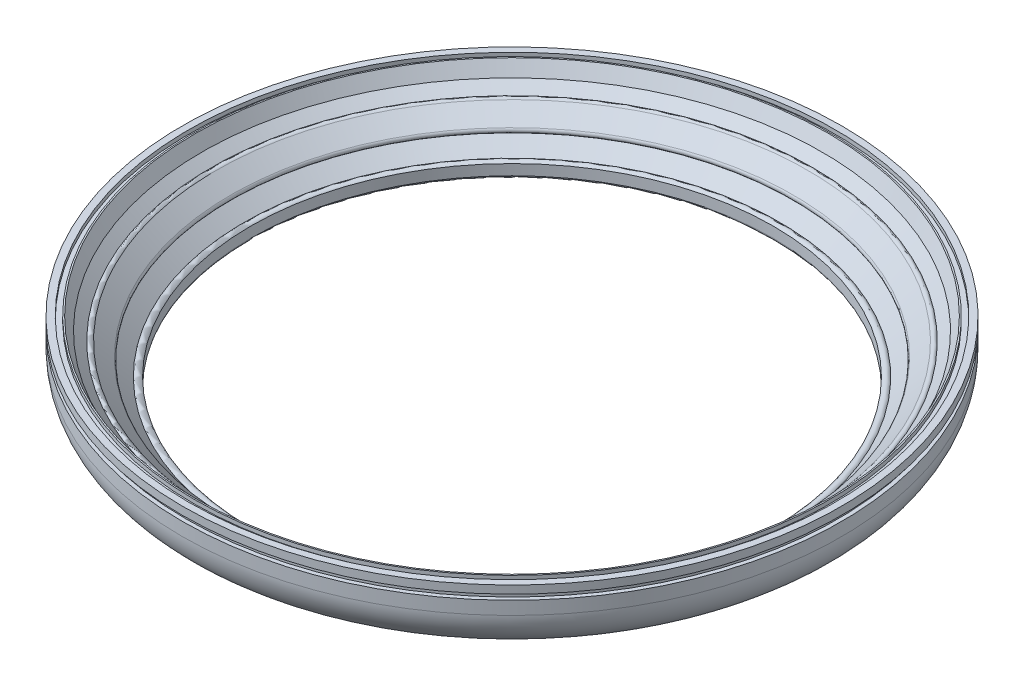
ISO-10303-21;
HEADER;
FILE_DESCRIPTION(('STEP AP214'),'2;1');
FILE_NAME('part.step','',(''),(''),'','','');
FILE_SCHEMA(('AUTOMOTIVE_DESIGN { 1 0 10303 214 1 1 1 1 }'));
ENDSEC;
DATA;
#1=APPLICATION_CONTEXT('core data for automotive mechanical design processes');
#2=APPLICATION_PROTOCOL_DEFINITION('international standard','automotive_design',2000,#1);
#3=PRODUCT_CONTEXT('',#1,'mechanical');
#4=PRODUCT('Part','Part','',(#3));
#5=PRODUCT_RELATED_PRODUCT_CATEGORY('part','',(#4));
#6=PRODUCT_DEFINITION_FORMATION('','',#4);
#7=PRODUCT_DEFINITION_CONTEXT('part definition',#1,'design');
#8=PRODUCT_DEFINITION('design','',#6,#7);
#9=PRODUCT_DEFINITION_SHAPE('','',#8);
#10=(LENGTH_UNIT() NAMED_UNIT(*) SI_UNIT(.MILLI.,.METRE.));
#11=(NAMED_UNIT(*) PLANE_ANGLE_UNIT() SI_UNIT($,.RADIAN.));
#12=(NAMED_UNIT(*) SI_UNIT($,.STERADIAN.) SOLID_ANGLE_UNIT());
#13=UNCERTAINTY_MEASURE_WITH_UNIT(LENGTH_MEASURE(1.E-05),#10,'distance_accuracy_value','');
#14=(GEOMETRIC_REPRESENTATION_CONTEXT(3) GLOBAL_UNCERTAINTY_ASSIGNED_CONTEXT((#13)) GLOBAL_UNIT_ASSIGNED_CONTEXT((#10,
#11,#12)) REPRESENTATION_CONTEXT('',''));
#15=CARTESIAN_POINT('',(0.,0.,0.));
#16=DIRECTION('',(0.,0.,1.));
#17=DIRECTION('',(1.,0.,0.));
#18=AXIS2_PLACEMENT_3D('',#15,#16,#17);
#19=CARTESIAN_POINT('',(0.,0.199999999999997,0.));
#20=DIRECTION('',(0.,-1.,0.));
#21=DIRECTION('',(0.,0.,-1.));
#22=AXIS2_PLACEMENT_3D('',#19,#20,#21);
#23=TOROIDAL_SURFACE('',#22,20.0174788473333,0.2);
#24=CARTESIAN_POINT('',(0.,0.,0.));
#25=DIRECTION('',(0.,-1.,0.));
#26=DIRECTION('',(0.,0.,-1.));
#27=AXIS2_PLACEMENT_3D('',#24,#25,#26);
#28=CIRCLE('',#27,20.0174788473333);
#29=CARTESIAN_POINT('',(0.,0.,-20.0174788473333));
#30=VERTEX_POINT('',#29);
#31=EDGE_CURVE('E50',#30,#30,#28,.F.);
#32=ORIENTED_EDGE('',*,*,#31,.F.);
#33=EDGE_LOOP('',(#32));
#34=FACE_BOUND('',#33,.T.);
#35=CARTESIAN_POINT('',(0.,0.199999999999997,0.));
#36=DIRECTION('',(0.,-1.,0.));
#37=DIRECTION('',(0.,0.,-1.));
#38=AXIS2_PLACEMENT_3D('',#35,#36,#37);
#39=CIRCLE('',#38,19.8174788473333);
#40=CARTESIAN_POINT('',(0.,0.199999999999997,-19.8174788473333));
#41=VERTEX_POINT('',#40);
#42=EDGE_CURVE('E12',#41,#41,#39,.T.);
#43=ORIENTED_EDGE('',*,*,#42,.F.);
#44=EDGE_LOOP('',(#43));
#45=FACE_BOUND('',#44,.T.);
#46=ADVANCED_FACE('F44',(#34,#45),#23,.T.);
#47=CARTESIAN_POINT('',(0.,3.,0.));
#48=DIRECTION('',(0.,-1.,0.));
#49=DIRECTION('',(0.,0.,-1.));
#50=AXIS2_PLACEMENT_3D('',#47,#48,#49);
#51=TOROIDAL_SURFACE('',#50,22.,3.);
#52=CARTESIAN_POINT('',(0.,3.,0.));
#53=DIRECTION('',(0.,-1.,0.));
#54=DIRECTION('',(0.,0.,-1.));
#55=AXIS2_PLACEMENT_3D('',#52,#53,#54);
#56=CIRCLE('',#55,25.);
#57=CARTESIAN_POINT('',(0.,3.,-25.));
#58=VERTEX_POINT('',#57);
#59=EDGE_CURVE('E58',#58,#58,#56,.F.);
#60=ORIENTED_EDGE('',*,*,#59,.F.);
#61=EDGE_LOOP('',(#60));
#62=FACE_BOUND('',#61,.T.);
#63=CARTESIAN_POINT('',(0.,0.,0.));
#64=DIRECTION('',(0.,-1.,0.));
#65=DIRECTION('',(0.,0.,-1.));
#66=AXIS2_PLACEMENT_3D('',#63,#64,#65);
#67=CIRCLE('',#66,22.);
#68=CARTESIAN_POINT('',(0.,0.,-22.));
#69=VERTEX_POINT('',#68);
#70=EDGE_CURVE('E54',#69,#69,#67,.T.);
#71=ORIENTED_EDGE('',*,*,#70,.F.);
#72=EDGE_LOOP('',(#71));
#73=FACE_BOUND('',#72,.T.);
#74=ADVANCED_FACE('F131',(#62,#73),#51,.T.);
#75=CARTESIAN_POINT('',(-25.,0.,0.));
#76=DIRECTION('',(0.,-1.,0.));
#77=DIRECTION('',(0.,0.,-1.));
#78=AXIS2_PLACEMENT_3D('',#75,#76,#77);
#79=PLANE('',#78);
#80=ORIENTED_EDGE('',*,*,#31,.T.);
#81=EDGE_LOOP('',(#80));
#82=FACE_BOUND('',#81,.T.);
#83=ORIENTED_EDGE('',*,*,#70,.T.);
#84=EDGE_LOOP('',(#83));
#85=FACE_BOUND('',#84,.T.);
#86=ADVANCED_FACE('F136',(#82,#85),#79,.T.);
#87=CARTESIAN_POINT('',(0.,2.8090333853554,0.));
#88=DIRECTION('',(0.,1.,0.));
#89=DIRECTION('',(0.,0.,1.));
#90=AXIS2_PLACEMENT_3D('',#87,#88,#89);
#91=CYLINDRICAL_SURFACE('',#90,25.);
#92=ORIENTED_EDGE('',*,*,#59,.T.);
#93=EDGE_LOOP('',(#92));
#94=FACE_BOUND('',#93,.T.);
#95=CARTESIAN_POINT('',(0.,4.,0.));
#96=DIRECTION('',(0.,1.,0.));
#97=DIRECTION('',(0.,0.,1.));
#98=AXIS2_PLACEMENT_3D('',#95,#96,#97);
#99=CIRCLE('',#98,25.);
#100=CARTESIAN_POINT('',(0.,4.,25.));
#101=VERTEX_POINT('',#100);
#102=EDGE_CURVE('E63',#101,#101,#99,.T.);
#103=ORIENTED_EDGE('',*,*,#102,.F.);
#104=EDGE_LOOP('',(#103));
#105=FACE_BOUND('',#104,.T.);
#106=ADVANCED_FACE('F142',(#94,#105),#91,.T.);
#107=CARTESIAN_POINT('',(-25.,4.,0.));
#108=DIRECTION('',(0.,1.,0.));
#109=DIRECTION('',(0.,0.,1.));
#110=AXIS2_PLACEMENT_3D('',#107,#108,#109);
#111=PLANE('',#110);
#112=ORIENTED_EDGE('',*,*,#102,.T.);
#113=EDGE_LOOP('',(#112));
#114=FACE_BOUND('',#113,.T.);
#115=CARTESIAN_POINT('',(0.,4.,0.));
#116=DIRECTION('',(0.,1.,0.));
#117=DIRECTION('',(0.,0.,1.));
#118=AXIS2_PLACEMENT_3D('',#115,#116,#117);
#119=CIRCLE('',#118,24.7);
#120=CARTESIAN_POINT('',(0.,4.,24.7));
#121=VERTEX_POINT('',#120);
#122=EDGE_CURVE('E66',#121,#121,#119,.T.);
#123=ORIENTED_EDGE('',*,*,#122,.F.);
#124=EDGE_LOOP('',(#123));
#125=FACE_BOUND('',#124,.T.);
#126=ADVANCED_FACE('F149',(#114,#125),#111,.T.);
#127=CARTESIAN_POINT('',(0.,2.8090333853554,0.));
#128=DIRECTION('',(0.,1.,0.));
#129=DIRECTION('',(0.,0.,1.));
#130=AXIS2_PLACEMENT_3D('',#127,#128,#129);
#131=CYLINDRICAL_SURFACE('',#130,24.7);
#132=ORIENTED_EDGE('',*,*,#122,.T.);
#133=EDGE_LOOP('',(#132));
#134=FACE_BOUND('',#133,.T.);
#135=CARTESIAN_POINT('',(0.,4.4,0.));
#136=DIRECTION('',(0.,1.,0.));
#137=DIRECTION('',(0.,0.,1.));
#138=AXIS2_PLACEMENT_3D('',#135,#136,#137);
#139=CIRCLE('',#138,24.7);
#140=CARTESIAN_POINT('',(0.,4.4,24.7));
#141=VERTEX_POINT('',#140);
#142=EDGE_CURVE('E69',#141,#141,#139,.T.);
#143=ORIENTED_EDGE('',*,*,#142,.F.);
#144=EDGE_LOOP('',(#143));
#145=FACE_BOUND('',#144,.T.);
#146=ADVANCED_FACE('F153',(#134,#145),#131,.T.);
#147=CARTESIAN_POINT('',(-24.7,4.4,0.));
#148=DIRECTION('',(0.,-1.,0.));
#149=DIRECTION('',(0.,0.,-1.));
#150=AXIS2_PLACEMENT_3D('',#147,#148,#149);
#151=PLANE('',#150);
#152=ORIENTED_EDGE('',*,*,#142,.T.);
#153=EDGE_LOOP('',(#152));
#154=FACE_BOUND('',#153,.T.);
#155=CARTESIAN_POINT('',(0.,4.4,0.));
#156=DIRECTION('',(0.,1.,0.));
#157=DIRECTION('',(0.,0.,1.));
#158=AXIS2_PLACEMENT_3D('',#155,#156,#157);
#159=CIRCLE('',#158,25.);
#160=CARTESIAN_POINT('',(0.,4.4,25.));
#161=VERTEX_POINT('',#160);
#162=EDGE_CURVE('E72',#161,#161,#159,.T.);
#163=ORIENTED_EDGE('',*,*,#162,.F.);
#164=EDGE_LOOP('',(#163));
#165=FACE_BOUND('',#164,.T.);
#166=ADVANCED_FACE('F157',(#154,#165),#151,.T.);
#167=CARTESIAN_POINT('',(0.,2.8090333853554,0.));
#168=DIRECTION('',(0.,1.,0.));
#169=DIRECTION('',(0.,0.,1.));
#170=AXIS2_PLACEMENT_3D('',#167,#168,#169);
#171=CYLINDRICAL_SURFACE('',#170,25.);
#172=ORIENTED_EDGE('',*,*,#162,.T.);
#173=EDGE_LOOP('',(#172));
#174=FACE_BOUND('',#173,.T.);
#175=CARTESIAN_POINT('',(0.,5.,0.));
#176=DIRECTION('',(0.,1.,0.));
#177=DIRECTION('',(0.,0.,1.));
#178=AXIS2_PLACEMENT_3D('',#175,#176,#177);
#179=CIRCLE('',#178,25.);
#180=CARTESIAN_POINT('',(0.,5.,25.));
#181=VERTEX_POINT('',#180);
#182=EDGE_CURVE('E75',#181,#181,#179,.T.);
#183=ORIENTED_EDGE('',*,*,#182,.F.);
#184=EDGE_LOOP('',(#183));
#185=FACE_BOUND('',#184,.T.);
#186=ADVANCED_FACE('F161',(#174,#185),#171,.T.);
#187=CARTESIAN_POINT('',(-24.502122849828,5.,0.));
#188=DIRECTION('',(0.,1.,0.));
#189=DIRECTION('',(0.,0.,1.));
#190=AXIS2_PLACEMENT_3D('',#187,#188,#189);
#191=PLANE('',#190);
#192=ORIENTED_EDGE('',*,*,#182,.T.);
#193=EDGE_LOOP('',(#192));
#194=FACE_BOUND('',#193,.T.);
#195=CARTESIAN_POINT('',(0.,5.,0.));
#196=DIRECTION('',(0.,1.,0.));
#197=DIRECTION('',(0.,0.,1.));
#198=AXIS2_PLACEMENT_3D('',#195,#196,#197);
#199=CIRCLE('',#198,24.502122849828);
#200=CARTESIAN_POINT('',(0.,5.,24.502122849828));
#201=VERTEX_POINT('',#200);
#202=EDGE_CURVE('E78',#201,#201,#199,.T.);
#203=ORIENTED_EDGE('',*,*,#202,.F.);
#204=EDGE_LOOP('',(#203));
#205=FACE_BOUND('',#204,.T.);
#206=ADVANCED_FACE('F165',(#194,#205),#191,.T.);
#207=CARTESIAN_POINT('',(0.,2.8090333853554,0.));
#208=DIRECTION('',(0.,1.,0.));
#209=DIRECTION('',(0.,0.,1.));
#210=AXIS2_PLACEMENT_3D('',#207,#208,#209);
#211=CYLINDRICAL_SURFACE('',#210,24.502122849828);
#212=ORIENTED_EDGE('',*,*,#202,.T.);
#213=EDGE_LOOP('',(#212));
#214=FACE_BOUND('',#213,.T.);
#215=CARTESIAN_POINT('',(0.,4.7,0.));
#216=DIRECTION('',(0.,1.,0.));
#217=DIRECTION('',(0.,0.,1.));
#218=AXIS2_PLACEMENT_3D('',#215,#216,#217);
#219=CIRCLE('',#218,24.502122849828);
#220=CARTESIAN_POINT('',(0.,4.7,24.502122849828));
#221=VERTEX_POINT('',#220);
#222=EDGE_CURVE('E81',#221,#221,#219,.T.);
#223=ORIENTED_EDGE('',*,*,#222,.F.);
#224=EDGE_LOOP('',(#223));
#225=FACE_BOUND('',#224,.T.);
#226=ADVANCED_FACE('F169',(#214,#225),#211,.F.);
#227=CARTESIAN_POINT('',(-24.502122849828,4.7,0.));
#228=DIRECTION('',(0.,1.,0.));
#229=DIRECTION('',(0.,0.,1.));
#230=AXIS2_PLACEMENT_3D('',#227,#228,#229);
#231=PLANE('',#230);
#232=ORIENTED_EDGE('',*,*,#222,.T.);
#233=EDGE_LOOP('',(#232));
#234=FACE_BOUND('',#233,.T.);
#235=CARTESIAN_POINT('',(0.,4.7,0.));
#236=DIRECTION('',(0.,1.,0.));
#237=DIRECTION('',(0.,0.,1.));
#238=AXIS2_PLACEMENT_3D('',#235,#236,#237);
#239=CIRCLE('',#238,24.1030521569592);
#240=CARTESIAN_POINT('',(0.,4.7,24.1030521569592));
#241=VERTEX_POINT('',#240);
#242=EDGE_CURVE('E84',#241,#241,#239,.T.);
#243=ORIENTED_EDGE('',*,*,#242,.F.);
#244=EDGE_LOOP('',(#243));
#245=FACE_BOUND('',#244,.T.);
#246=ADVANCED_FACE('F173',(#234,#245),#231,.T.);
#247=CARTESIAN_POINT('',(0.,2.8090333853554,0.));
#248=DIRECTION('',(0.,1.,0.));
#249=DIRECTION('',(0.,0.,1.));
#250=AXIS2_PLACEMENT_3D('',#247,#248,#249);
#251=CYLINDRICAL_SURFACE('',#250,24.1030521569592);
#252=ORIENTED_EDGE('',*,*,#242,.T.);
#253=EDGE_LOOP('',(#252));
#254=FACE_BOUND('',#253,.T.);
#255=CARTESIAN_POINT('',(0.,5.,0.));
#256=DIRECTION('',(0.,1.,0.));
#257=DIRECTION('',(0.,0.,1.));
#258=AXIS2_PLACEMENT_3D('',#255,#256,#257);
#259=CIRCLE('',#258,24.1030521569592);
#260=CARTESIAN_POINT('',(0.,5.,24.1030521569592));
#261=VERTEX_POINT('',#260);
#262=EDGE_CURVE('E87',#261,#261,#259,.T.);
#263=ORIENTED_EDGE('',*,*,#262,.F.);
#264=EDGE_LOOP('',(#263));
#265=FACE_BOUND('',#264,.T.);
#266=ADVANCED_FACE('F177',(#254,#265),#251,.T.);
#267=CARTESIAN_POINT('',(-24.1030521569592,5.,0.));
#268=DIRECTION('',(0.,1.,0.));
#269=DIRECTION('',(0.,0.,1.));
#270=AXIS2_PLACEMENT_3D('',#267,#268,#269);
#271=PLANE('',#270);
#272=ORIENTED_EDGE('',*,*,#262,.T.);
#273=EDGE_LOOP('',(#272));
#274=FACE_BOUND('',#273,.T.);
#275=CARTESIAN_POINT('',(0.,5.,0.));
#276=DIRECTION('',(0.,1.,0.));
#277=DIRECTION('',(0.,0.,1.));
#278=AXIS2_PLACEMENT_3D('',#275,#276,#277);
#279=CIRCLE('',#278,23.9986224429374);
#280=CARTESIAN_POINT('',(0.,5.,23.9986224429374));
#281=VERTEX_POINT('',#280);
#282=EDGE_CURVE('E90',#281,#281,#279,.T.);
#283=ORIENTED_EDGE('',*,*,#282,.F.);
#284=EDGE_LOOP('',(#283));
#285=FACE_BOUND('',#284,.T.);
#286=ADVANCED_FACE('F181',(#274,#285),#271,.T.);
#287=CARTESIAN_POINT('',(0.,4.0073172658037,0.));
#288=DIRECTION('',(0.,1.,0.));
#289=DIRECTION('',(0.,0.,1.));
#290=AXIS2_PLACEMENT_3D('',#287,#288,#289);
#291=CONICAL_SURFACE('',#290,23.5247226758679,0.445398980476274);
#292=ORIENTED_EDGE('',*,*,#282,.T.);
#293=EDGE_LOOP('',(#292));
#294=FACE_BOUND('',#293,.T.);
#295=CARTESIAN_POINT('',(0.,4.0073172658037,0.));
#296=DIRECTION('',(0.,1.,0.));
#297=DIRECTION('',(0.,0.,1.));
#298=AXIS2_PLACEMENT_3D('',#295,#296,#297);
#299=CIRCLE('',#298,23.5247226758679);
#300=CARTESIAN_POINT('',(0.,4.0073172658037,23.5247226758679));
#301=VERTEX_POINT('',#300);
#302=EDGE_CURVE('E93',#301,#301,#299,.T.);
#303=ORIENTED_EDGE('',*,*,#302,.F.);
#304=EDGE_LOOP('',(#303));
#305=FACE_BOUND('',#304,.T.);
#306=ADVANCED_FACE('F185',(#294,#305),#291,.F.);
#307=CARTESIAN_POINT('',(0.,3.34104867246223,0.));
#308=DIRECTION('',(0.,1.,0.));
#309=DIRECTION('',(0.,0.,1.));
#310=AXIS2_PLACEMENT_3D('',#307,#308,#309);
#311=CONICAL_SURFACE('',#310,22.8132032034841,0.818229496758382);
#312=ORIENTED_EDGE('',*,*,#302,.T.);
#313=EDGE_LOOP('',(#312));
#314=FACE_BOUND('',#313,.T.);
#315=CARTESIAN_POINT('',(0.,3.34104867246223,0.));
#316=DIRECTION('',(0.,1.,0.));
#317=DIRECTION('',(0.,0.,1.));
#318=AXIS2_PLACEMENT_3D('',#315,#316,#317);
#319=CIRCLE('',#318,22.8132032034841);
#320=CARTESIAN_POINT('',(0.,3.34104867246223,22.8132032034841));
#321=VERTEX_POINT('',#320);
#322=EDGE_CURVE('E96',#321,#321,#319,.T.);
#323=ORIENTED_EDGE('',*,*,#322,.F.);
#324=EDGE_LOOP('',(#323));
#325=FACE_BOUND('',#324,.T.);
#326=ADVANCED_FACE('F189',(#314,#325),#311,.F.);
#327=CARTESIAN_POINT('',(0.,3.15870645897315,0.));
#328=DIRECTION('',(0.,1.,0.));
#329=DIRECTION('',(0.,0.,1.));
#330=AXIS2_PLACEMENT_3D('',#327,#328,#329);
#331=TOROIDAL_SURFACE('',#330,22.630860989995,0.257870831309389);
#332=ORIENTED_EDGE('',*,*,#322,.T.);
#333=EDGE_LOOP('',(#332));
#334=FACE_BOUND('',#333,.T.);
#335=CARTESIAN_POINT('',(0.,3.34104867246223,0.));
#336=DIRECTION('',(0.,1.,0.));
#337=DIRECTION('',(0.,0.,1.));
#338=AXIS2_PLACEMENT_3D('',#335,#336,#337);
#339=CIRCLE('',#338,22.4485187765059);
#340=CARTESIAN_POINT('',(0.,3.34104867246223,22.4485187765059));
#341=VERTEX_POINT('',#340);
#342=EDGE_CURVE('E99',#341,#341,#339,.T.);
#343=ORIENTED_EDGE('',*,*,#342,.F.);
#344=EDGE_LOOP('',(#343));
#345=FACE_BOUND('',#344,.T.);
#346=ADVANCED_FACE('F193',(#334,#345),#331,.T.);
#347=CARTESIAN_POINT('',(0.,2.29086359903903,0.));
#348=DIRECTION('',(0.,1.,0.));
#349=DIRECTION('',(0.,0.,1.));
#350=AXIS2_PLACEMENT_3D('',#347,#348,#349);
#351=CONICAL_SURFACE('',#350,21.327008417448,0.818229496758382);
#352=ORIENTED_EDGE('',*,*,#342,.T.);
#353=EDGE_LOOP('',(#352));
#354=FACE_BOUND('',#353,.T.);
#355=CARTESIAN_POINT('',(0.,2.29086359903903,0.));
#356=DIRECTION('',(0.,1.,0.));
#357=DIRECTION('',(0.,0.,1.));
#358=AXIS2_PLACEMENT_3D('',#355,#356,#357);
#359=CIRCLE('',#358,21.327008417448);
#360=CARTESIAN_POINT('',(0.,2.29086359903903,21.327008417448));
#361=VERTEX_POINT('',#360);
#362=EDGE_CURVE('E102',#361,#361,#359,.T.);
#363=ORIENTED_EDGE('',*,*,#362,.F.);
#364=EDGE_LOOP('',(#363));
#365=FACE_BOUND('',#364,.T.);
#366=ADVANCED_FACE('F197',(#354,#365),#351,.F.);
#367=CARTESIAN_POINT('',(0.,2.12011789944331,0.));
#368=DIRECTION('',(0.,1.,0.));
#369=DIRECTION('',(0.,0.,1.));
#370=AXIS2_PLACEMENT_3D('',#367,#368,#369);
#371=TOROIDAL_SURFACE('',#370,21.4977541170438,0.241470884085142);
#372=ORIENTED_EDGE('',*,*,#362,.T.);
#373=EDGE_LOOP('',(#372));
#374=FACE_BOUND('',#373,.T.);
#375=CARTESIAN_POINT('',(0.,1.9493721998476,0.));
#376=DIRECTION('',(0.,1.,0.));
#377=DIRECTION('',(0.,0.,1.));
#378=AXIS2_PLACEMENT_3D('',#375,#376,#377);
#379=CIRCLE('',#378,21.327008417448);
#380=CARTESIAN_POINT('',(0.,1.9493721998476,21.327008417448));
#381=VERTEX_POINT('',#380);
#382=EDGE_CURVE('E105',#381,#381,#379,.T.);
#383=ORIENTED_EDGE('',*,*,#382,.F.);
#384=EDGE_LOOP('',(#383));
#385=FACE_BOUND('',#384,.T.);
#386=ADVANCED_FACE('F127',(#374,#385),#371,.T.);
#387=CARTESIAN_POINT('',(0.,0.999852878843531,0.));
#388=DIRECTION('',(0.,1.,0.));
#389=DIRECTION('',(0.,0.,1.));
#390=AXIS2_PLACEMENT_3D('',#387,#388,#389);
#391=CONICAL_SURFACE('',#390,20.313000713872,0.818229496758382);
#392=ORIENTED_EDGE('',*,*,#382,.T.);
#393=EDGE_LOOP('',(#392));
#394=FACE_BOUND('',#393,.T.);
#395=CARTESIAN_POINT('',(0.,0.999852878843531,0.));
#396=DIRECTION('',(0.,1.,0.));
#397=DIRECTION('',(0.,0.,1.));
#398=AXIS2_PLACEMENT_3D('',#395,#396,#397);
#399=CIRCLE('',#398,20.313000713872);
#400=CARTESIAN_POINT('',(0.,0.999852878843531,20.313000713872));
#401=VERTEX_POINT('',#400);
#402=EDGE_CURVE('E108',#401,#401,#399,.T.);
#403=ORIENTED_EDGE('',*,*,#402,.F.);
#404=EDGE_LOOP('',(#403));
#405=FACE_BOUND('',#404,.T.);
#406=ADVANCED_FACE('F119',(#394,#405),#391,.F.);
#407=CARTESIAN_POINT('',(0.,0.767784388324657,0.));
#408=DIRECTION('',(0.,1.,0.));
#409=DIRECTION('',(0.,0.,1.));
#410=AXIS2_PLACEMENT_3D('',#407,#408,#409);
#411=TOROIDAL_SURFACE('',#410,20.0651708572931,0.339522344041833);
#412=ORIENTED_EDGE('',*,*,#402,.T.);
#413=EDGE_LOOP('',(#412));
#414=FACE_BOUND('',#413,.T.);
#415=CARTESIAN_POINT('',(0.,0.999999999999996,0.));
#416=DIRECTION('',(0.,1.,0.));
#417=DIRECTION('',(0.,0.,1.));
#418=AXIS2_PLACEMENT_3D('',#415,#416,#417);
#419=CIRCLE('',#418,19.8174788473333);
#420=CARTESIAN_POINT('',(0.,0.999999999999996,19.8174788473333));
#421=VERTEX_POINT('',#420);
#422=EDGE_CURVE('E111',#421,#421,#419,.T.);
#423=ORIENTED_EDGE('',*,*,#422,.F.);
#424=EDGE_LOOP('',(#423));
#425=FACE_BOUND('',#424,.T.);
#426=ADVANCED_FACE('F117',(#414,#425),#411,.T.);
#427=CARTESIAN_POINT('',(0.,2.8090333853554,0.));
#428=DIRECTION('',(0.,1.,0.));
#429=DIRECTION('',(0.,0.,1.));
#430=AXIS2_PLACEMENT_3D('',#427,#428,#429);
#431=CYLINDRICAL_SURFACE('',#430,19.8174788473333);
#432=ORIENTED_EDGE('',*,*,#42,.T.);
#433=EDGE_LOOP('',(#432));
#434=FACE_BOUND('',#433,.T.);
#435=ORIENTED_EDGE('',*,*,#422,.T.);
#436=EDGE_LOOP('',(#435));
#437=FACE_BOUND('',#436,.T.);
#438=ADVANCED_FACE('F115',(#434,#437),#431,.F.);
#439=CLOSED_SHELL('',(#46,#74,#86,#106,#126,#146,#166,#186,#206,#226,#246,#266,#286,#306,#326,
#346,#366,#386,#406,#426,#438));
#440=MANIFOLD_SOLID_BREP('B2',#439);
#441=ADVANCED_BREP_SHAPE_REPRESENTATION('',(#18,#440),#14);
#442=SHAPE_DEFINITION_REPRESENTATION(#9,#441);
ENDSEC;
END-ISO-10303-21;
